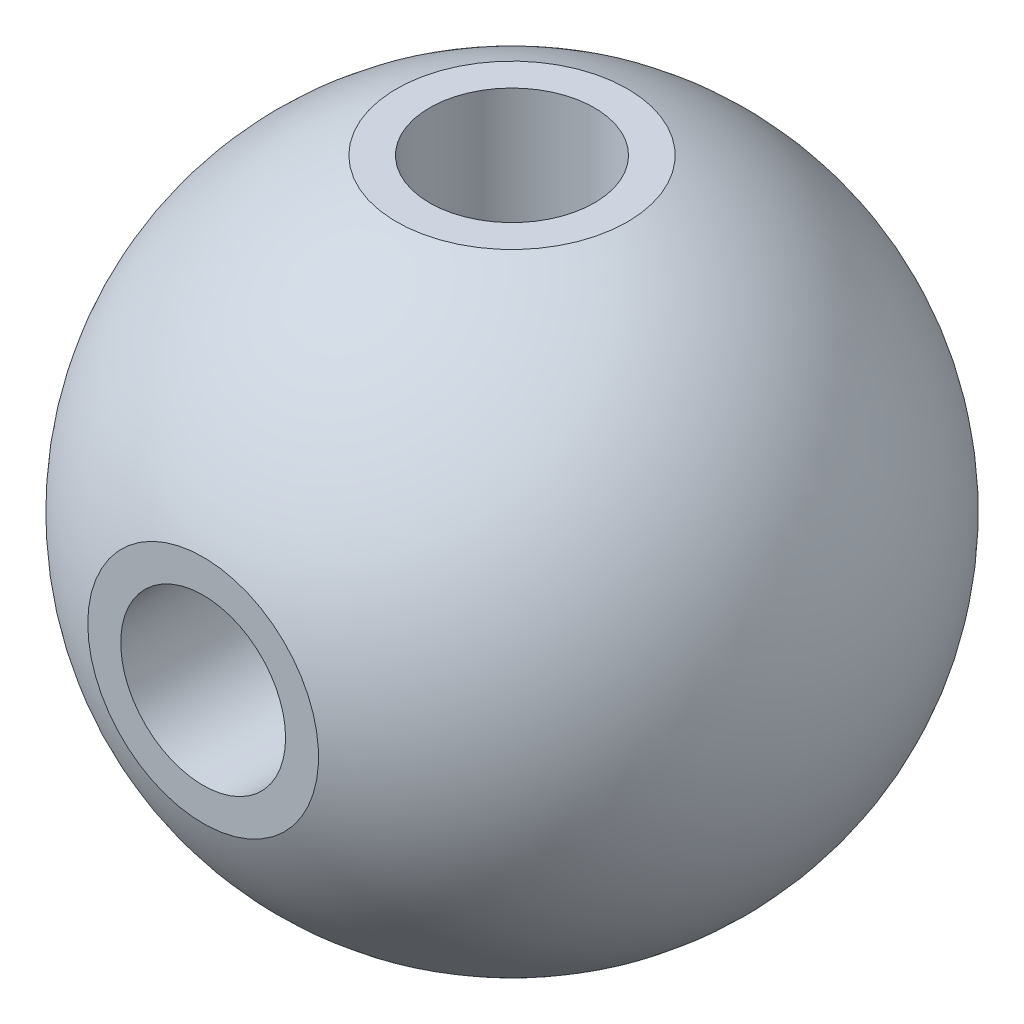
ISO-10303-21;
HEADER;
FILE_DESCRIPTION(('STEP AP214'),'2;1');
FILE_NAME('part.step','',(''),(''),'','','');
FILE_SCHEMA(('AUTOMOTIVE_DESIGN { 1 0 10303 214 1 1 1 1 }'));
ENDSEC;
DATA;
#1=APPLICATION_CONTEXT('core data for automotive mechanical design processes');
#2=APPLICATION_PROTOCOL_DEFINITION('international standard','automotive_design',2000,#1);
#3=PRODUCT_CONTEXT('',#1,'mechanical');
#4=PRODUCT('Part','Part','',(#3));
#5=PRODUCT_RELATED_PRODUCT_CATEGORY('part','',(#4));
#6=PRODUCT_DEFINITION_FORMATION('','',#4);
#7=PRODUCT_DEFINITION_CONTEXT('part definition',#1,'design');
#8=PRODUCT_DEFINITION('design','',#6,#7);
#9=PRODUCT_DEFINITION_SHAPE('','',#8);
#10=(LENGTH_UNIT() NAMED_UNIT(*) SI_UNIT(.MILLI.,.METRE.));
#11=(NAMED_UNIT(*) PLANE_ANGLE_UNIT() SI_UNIT($,.RADIAN.));
#12=(NAMED_UNIT(*) SI_UNIT($,.STERADIAN.) SOLID_ANGLE_UNIT());
#13=UNCERTAINTY_MEASURE_WITH_UNIT(LENGTH_MEASURE(1.E-05),#10,'distance_accuracy_value','');
#14=(GEOMETRIC_REPRESENTATION_CONTEXT(3) GLOBAL_UNCERTAINTY_ASSIGNED_CONTEXT((#13)) GLOBAL_UNIT_ASSIGNED_CONTEXT((#10,
#11,#12)) REPRESENTATION_CONTEXT('',''));
#15=CARTESIAN_POINT('',(0.,0.,0.));
#16=DIRECTION('',(0.,0.,1.));
#17=DIRECTION('',(1.,0.,0.));
#18=AXIS2_PLACEMENT_3D('',#15,#16,#17);
#19=CARTESIAN_POINT('',(0.,0.,0.));
#20=DIRECTION('',(0.,-1.,0.));
#21=DIRECTION('',(1.,0.,0.));
#22=AXIS2_PLACEMENT_3D('',#19,#20,#21);
#23=SPHERICAL_SURFACE('',#22,12.7);
#24=CARTESIAN_POINT('',(0.,11.8967211869489,0.));
#25=DIRECTION('',(0.,-1.,0.));
#26=DIRECTION('',(0.,0.,-1.));
#27=AXIS2_PLACEMENT_3D('',#24,#25,#26);
#28=CIRCLE('',#27,4.445);
#29=CARTESIAN_POINT('',(0.,11.8967211869489,-4.445));
#30=VERTEX_POINT('',#29);
#31=EDGE_CURVE('E70',#30,#30,#28,.T.);
#32=ORIENTED_EDGE('',*,*,#31,.T.);
#33=EDGE_LOOP('',(#32));
#34=FACE_BOUND('',#33,.T.);
#35=CARTESIAN_POINT('',(0.,0.,-11.8967211869489));
#36=DIRECTION('',(0.,0.,1.));
#37=DIRECTION('',(1.,0.,0.));
#38=AXIS2_PLACEMENT_3D('',#35,#36,#37);
#39=CIRCLE('',#38,4.445);
#40=CARTESIAN_POINT('',(4.445,0.,-11.8967211869489));
#41=VERTEX_POINT('',#40);
#42=EDGE_CURVE('E60',#41,#41,#39,.T.);
#43=ORIENTED_EDGE('',*,*,#42,.T.);
#44=EDGE_LOOP('',(#43));
#45=FACE_BOUND('',#44,.T.);
#46=CARTESIAN_POINT('',(0.,0.,11.8967211869489));
#47=DIRECTION('',(0.,0.,-1.));
#48=DIRECTION('',(-1.,0.,0.));
#49=AXIS2_PLACEMENT_3D('',#46,#47,#48);
#50=CIRCLE('',#49,4.445);
#51=CARTESIAN_POINT('',(-4.445,0.,11.8967211869489));
#52=VERTEX_POINT('',#51);
#53=EDGE_CURVE('E10',#52,#52,#50,.T.);
#54=ORIENTED_EDGE('',*,*,#53,.T.);
#55=EDGE_LOOP('',(#54));
#56=FACE_BOUND('',#55,.T.);
#57=ADVANCED_FACE('F42',(#34,#45,#56),#23,.T.);
#58=CARTESIAN_POINT('',(0.,0.,11.8967211869489));
#59=DIRECTION('',(0.,0.,-1.));
#60=DIRECTION('',(-1.,0.,0.));
#61=AXIS2_PLACEMENT_3D('',#58,#59,#60);
#62=PLANE('',#61);
#63=CARTESIAN_POINT('',(0.,0.,11.8967211869489));
#64=DIRECTION('',(0.,0.,1.));
#65=DIRECTION('',(1.,0.,0.));
#66=AXIS2_PLACEMENT_3D('',#63,#64,#65);
#67=CIRCLE('',#66,3.175);
#68=CARTESIAN_POINT('',(3.175,0.,11.8967211869489));
#69=VERTEX_POINT('',#68);
#70=EDGE_CURVE('E54',#69,#69,#67,.T.);
#71=ORIENTED_EDGE('',*,*,#70,.F.);
#72=EDGE_LOOP('',(#71));
#73=FACE_BOUND('',#72,.T.);
#74=ORIENTED_EDGE('',*,*,#53,.F.);
#75=EDGE_LOOP('',(#74));
#76=FACE_BOUND('',#75,.T.);
#77=ADVANCED_FACE('F103',(#73,#76),#62,.F.);
#78=CARTESIAN_POINT('',(0.,0.,4.27672118694895));
#79=DIRECTION('',(0.,0.,1.));
#80=DIRECTION('',(1.,0.,0.));
#81=AXIS2_PLACEMENT_3D('',#78,#79,#80);
#82=CYLINDRICAL_SURFACE('',#81,3.175);
#83=CARTESIAN_POINT('',(0.,0.,4.27672118694895));
#84=DIRECTION('',(0.,0.,1.));
#85=DIRECTION('',(1.,0.,0.));
#86=AXIS2_PLACEMENT_3D('',#83,#84,#85);
#87=CIRCLE('',#86,3.175);
#88=CARTESIAN_POINT('',(3.175,0.,4.27672118694895));
#89=VERTEX_POINT('',#88);
#90=EDGE_CURVE('E49',#89,#89,#87,.T.);
#91=CARTESIAN_POINT('',(3.175,0.,4.27672118694895));
#92=CARTESIAN_POINT('',(3.175,0.,4.35609618694895));
#93=CARTESIAN_POINT('',(3.175,0.,4.43547118694895));
#94=CARTESIAN_POINT('',(3.175,0.,4.59422118694895));
#95=CARTESIAN_POINT('',(3.175,0.,4.67359618694895));
#96=CARTESIAN_POINT('',(3.175,0.,4.83234618694895));
#97=CARTESIAN_POINT('',(3.175,0.,4.91172118694895));
#98=CARTESIAN_POINT('',(3.175,0.,5.07047118694895));
#99=CARTESIAN_POINT('',(3.175,0.,5.14984618694895));
#100=CARTESIAN_POINT('',(3.175,0.,5.30859618694895));
#101=CARTESIAN_POINT('',(3.175,0.,5.38797118694895));
#102=CARTESIAN_POINT('',(3.175,0.,5.54672118694895));
#103=CARTESIAN_POINT('',(3.175,0.,5.62609618694895));
#104=CARTESIAN_POINT('',(3.175,0.,5.78484618694895));
#105=CARTESIAN_POINT('',(3.175,0.,5.86422118694895));
#106=CARTESIAN_POINT('',(3.175,0.,6.02297118694895));
#107=CARTESIAN_POINT('',(3.175,0.,6.10234618694895));
#108=CARTESIAN_POINT('',(3.175,0.,6.26109618694895));
#109=CARTESIAN_POINT('',(3.175,0.,6.34047118694895));
#110=CARTESIAN_POINT('',(3.175,0.,6.49922118694895));
#111=CARTESIAN_POINT('',(3.175,0.,6.57859618694895));
#112=CARTESIAN_POINT('',(3.175,0.,6.73734618694895));
#113=CARTESIAN_POINT('',(3.175,0.,6.81672118694895));
#114=CARTESIAN_POINT('',(3.175,0.,6.97547118694895));
#115=CARTESIAN_POINT('',(3.175,0.,7.05484618694895));
#116=CARTESIAN_POINT('',(3.175,0.,7.21359618694895));
#117=CARTESIAN_POINT('',(3.175,0.,7.29297118694895));
#118=CARTESIAN_POINT('',(3.175,0.,7.45172118694895));
#119=CARTESIAN_POINT('',(3.175,0.,7.53109618694895));
#120=CARTESIAN_POINT('',(3.175,0.,7.68984618694895));
#121=CARTESIAN_POINT('',(3.175,0.,7.76922118694895));
#122=CARTESIAN_POINT('',(3.175,0.,7.92797118694895));
#123=CARTESIAN_POINT('',(3.175,0.,8.00734618694895));
#124=CARTESIAN_POINT('',(3.175,0.,8.16609618694895));
#125=CARTESIAN_POINT('',(3.175,0.,8.24547118694895));
#126=CARTESIAN_POINT('',(3.175,0.,8.40422118694895));
#127=CARTESIAN_POINT('',(3.175,0.,8.48359618694895));
#128=CARTESIAN_POINT('',(3.175,0.,8.64234618694895));
#129=CARTESIAN_POINT('',(3.175,0.,8.72172118694895));
#130=CARTESIAN_POINT('',(3.175,0.,8.88047118694895));
#131=CARTESIAN_POINT('',(3.175,0.,8.95984618694895));
#132=CARTESIAN_POINT('',(3.175,0.,9.11859618694895));
#133=CARTESIAN_POINT('',(3.175,0.,9.19797118694895));
#134=CARTESIAN_POINT('',(3.175,0.,9.35672118694895));
#135=CARTESIAN_POINT('',(3.175,0.,9.43609618694895));
#136=CARTESIAN_POINT('',(3.175,0.,9.59484618694895));
#137=CARTESIAN_POINT('',(3.175,0.,9.67422118694895));
#138=CARTESIAN_POINT('',(3.175,0.,9.83297118694895));
#139=CARTESIAN_POINT('',(3.175,0.,9.91234618694895));
#140=CARTESIAN_POINT('',(3.175,0.,10.0710961869489));
#141=CARTESIAN_POINT('',(3.175,0.,10.1504711869489));
#142=CARTESIAN_POINT('',(3.175,0.,10.3092211869489));
#143=CARTESIAN_POINT('',(3.175,0.,10.3885961869489));
#144=CARTESIAN_POINT('',(3.175,0.,10.5473461869489));
#145=CARTESIAN_POINT('',(3.175,0.,10.6267211869489));
#146=CARTESIAN_POINT('',(3.175,0.,10.7854711869489));
#147=CARTESIAN_POINT('',(3.175,0.,10.8648461869489));
#148=CARTESIAN_POINT('',(3.175,0.,11.0235961869489));
#149=CARTESIAN_POINT('',(3.175,0.,11.1029711869489));
#150=CARTESIAN_POINT('',(3.175,0.,11.2617211869489));
#151=CARTESIAN_POINT('',(3.175,0.,11.3410961869489));
#152=CARTESIAN_POINT('',(3.175,0.,11.4998461869489));
#153=CARTESIAN_POINT('',(3.175,0.,11.5792211869489));
#154=CARTESIAN_POINT('',(3.175,0.,11.7379711869489));
#155=CARTESIAN_POINT('',(3.175,0.,11.8173461869489));
#156=CARTESIAN_POINT('',(3.175,0.,11.8967211869489));
#157=B_SPLINE_CURVE_WITH_KNOTS('',3,(#91,#92,#93,#94,#95,#96,#97,#98,#99,#100,#101,#102,#103,
#104,#105,#106,#107,#108,#109,#110,#111,#112,#113,#114,#115,#116,#117,#118,#119,#120,#121,#122,
#123,#124,#125,#126,#127,#128,#129,#130,#131,#132,#133,#134,#135,#136,#137,#138,#139,#140,#141,
#142,#143,#144,#145,#146,#147,#148,#149,#150,#151,#152,#153,#154,#155,#156),.UNSPECIFIED.,.F.,
.F.,(4,2,2,2,2,2,2,2,2,2,2,2,2,2,2,2,2,2,2,2,2,2,2,2,2,2,2,2,2,2,2,2,4),(0.,0.238125,
0.476249999999999,0.714374999999999,0.952499999999999,1.190625,1.42875,1.666875,1.905,2.143125,
2.38125,2.619375,2.8575,3.095625,3.33375,3.571875,3.81,4.048125,4.28625,4.524375,4.7625,
5.000625,5.23875,5.476875,5.715,5.953125,6.19125,6.429375,6.6675,6.905625,7.14375,7.381875,
7.62),.UNSPECIFIED.);
#158=EDGE_CURVE('BSEAM118',#89,#69,#157,.T.);
#159=ORIENTED_EDGE('',*,*,#90,.F.);
#160=ORIENTED_EDGE('',*,*,#70,.T.);
#161=ORIENTED_EDGE('',*,*,#158,.T.);
#162=ORIENTED_EDGE('',*,*,#158,.F.);
#163=EDGE_LOOP('',(#159,#161,#160,#162));
#164=FACE_BOUND('',#163,.T.);
#165=ADVANCED_FACE('F118',(#164),#82,.F.);
#166=CARTESIAN_POINT('',(0.,0.,4.27672118694895));
#167=DIRECTION('',(0.,0.,1.));
#168=DIRECTION('',(1.,0.,0.));
#169=AXIS2_PLACEMENT_3D('',#166,#167,#168);
#170=PLANE('',#169);
#171=ORIENTED_EDGE('',*,*,#90,.T.);
#172=EDGE_LOOP('',(#171));
#173=FACE_BOUND('',#172,.T.);
#174=ADVANCED_FACE('F109',(#173),#170,.T.);
#175=CARTESIAN_POINT('',(0.,0.,-11.8967211869489));
#176=DIRECTION('',(0.,0.,1.));
#177=DIRECTION('',(1.,0.,0.));
#178=AXIS2_PLACEMENT_3D('',#175,#176,#177);
#179=PLANE('',#178);
#180=CARTESIAN_POINT('',(0.,0.,-11.8967211869489));
#181=DIRECTION('',(0.,0.,1.));
#182=DIRECTION('',(1.,0.,0.));
#183=AXIS2_PLACEMENT_3D('',#180,#181,#182);
#184=CIRCLE('',#183,3.175);
#185=CARTESIAN_POINT('',(-3.175,0.,-11.8967211869489));
#186=VERTEX_POINT('',#185);
#187=EDGE_CURVE('E66',#186,#186,#184,.T.);
#188=ORIENTED_EDGE('',*,*,#187,.T.);
#189=EDGE_LOOP('',(#188));
#190=FACE_BOUND('',#189,.T.);
#191=ORIENTED_EDGE('',*,*,#42,.F.);
#192=EDGE_LOOP('',(#191));
#193=FACE_BOUND('',#192,.T.);
#194=ADVANCED_FACE('F106',(#190,#193),#179,.F.);
#195=CARTESIAN_POINT('',(0.,0.,-4.27672118694895));
#196=DIRECTION('',(0.,0.,-1.));
#197=DIRECTION('',(-1.,0.,0.));
#198=AXIS2_PLACEMENT_3D('',#195,#196,#197);
#199=CYLINDRICAL_SURFACE('',#198,3.175);
#200=CARTESIAN_POINT('',(0.,0.,-4.27672118694895));
#201=DIRECTION('',(0.,0.,1.));
#202=DIRECTION('',(1.,0.,0.));
#203=AXIS2_PLACEMENT_3D('',#200,#201,#202);
#204=CIRCLE('',#203,3.175);
#205=CARTESIAN_POINT('',(-3.175,0.,-4.27672118694895));
#206=VERTEX_POINT('',#205);
#207=EDGE_CURVE('E65',#206,#206,#204,.T.);
#208=CARTESIAN_POINT('',(-3.175,0.,-4.27672118694895));
#209=CARTESIAN_POINT('',(-3.175,0.,-4.35609618694895));
#210=CARTESIAN_POINT('',(-3.175,0.,-4.43547118694895));
#211=CARTESIAN_POINT('',(-3.175,0.,-4.59422118694895));
#212=CARTESIAN_POINT('',(-3.175,0.,-4.67359618694895));
#213=CARTESIAN_POINT('',(-3.175,0.,-4.83234618694895));
#214=CARTESIAN_POINT('',(-3.175,0.,-4.91172118694895));
#215=CARTESIAN_POINT('',(-3.175,0.,-5.07047118694895));
#216=CARTESIAN_POINT('',(-3.175,0.,-5.14984618694895));
#217=CARTESIAN_POINT('',(-3.175,0.,-5.30859618694895));
#218=CARTESIAN_POINT('',(-3.175,0.,-5.38797118694895));
#219=CARTESIAN_POINT('',(-3.175,0.,-5.54672118694895));
#220=CARTESIAN_POINT('',(-3.175,0.,-5.62609618694895));
#221=CARTESIAN_POINT('',(-3.175,0.,-5.78484618694895));
#222=CARTESIAN_POINT('',(-3.175,0.,-5.86422118694895));
#223=CARTESIAN_POINT('',(-3.175,0.,-6.02297118694895));
#224=CARTESIAN_POINT('',(-3.175,0.,-6.10234618694895));
#225=CARTESIAN_POINT('',(-3.175,0.,-6.26109618694895));
#226=CARTESIAN_POINT('',(-3.175,0.,-6.34047118694895));
#227=CARTESIAN_POINT('',(-3.175,0.,-6.49922118694895));
#228=CARTESIAN_POINT('',(-3.175,0.,-6.57859618694895));
#229=CARTESIAN_POINT('',(-3.175,0.,-6.73734618694895));
#230=CARTESIAN_POINT('',(-3.175,0.,-6.81672118694895));
#231=CARTESIAN_POINT('',(-3.175,0.,-6.97547118694895));
#232=CARTESIAN_POINT('',(-3.175,0.,-7.05484618694895));
#233=CARTESIAN_POINT('',(-3.175,0.,-7.21359618694895));
#234=CARTESIAN_POINT('',(-3.175,0.,-7.29297118694895));
#235=CARTESIAN_POINT('',(-3.175,0.,-7.45172118694895));
#236=CARTESIAN_POINT('',(-3.175,0.,-7.53109618694895));
#237=CARTESIAN_POINT('',(-3.175,0.,-7.68984618694895));
#238=CARTESIAN_POINT('',(-3.175,0.,-7.76922118694895));
#239=CARTESIAN_POINT('',(-3.175,0.,-7.92797118694895));
#240=CARTESIAN_POINT('',(-3.175,0.,-8.00734618694895));
#241=CARTESIAN_POINT('',(-3.175,0.,-8.16609618694895));
#242=CARTESIAN_POINT('',(-3.175,0.,-8.24547118694895));
#243=CARTESIAN_POINT('',(-3.175,0.,-8.40422118694895));
#244=CARTESIAN_POINT('',(-3.175,0.,-8.48359618694895));
#245=CARTESIAN_POINT('',(-3.175,0.,-8.64234618694895));
#246=CARTESIAN_POINT('',(-3.175,0.,-8.72172118694895));
#247=CARTESIAN_POINT('',(-3.175,0.,-8.88047118694895));
#248=CARTESIAN_POINT('',(-3.175,0.,-8.95984618694895));
#249=CARTESIAN_POINT('',(-3.175,0.,-9.11859618694895));
#250=CARTESIAN_POINT('',(-3.175,0.,-9.19797118694895));
#251=CARTESIAN_POINT('',(-3.175,0.,-9.35672118694895));
#252=CARTESIAN_POINT('',(-3.175,0.,-9.43609618694895));
#253=CARTESIAN_POINT('',(-3.175,0.,-9.59484618694895));
#254=CARTESIAN_POINT('',(-3.175,0.,-9.67422118694895));
#255=CARTESIAN_POINT('',(-3.175,0.,-9.83297118694895));
#256=CARTESIAN_POINT('',(-3.175,0.,-9.91234618694895));
#257=CARTESIAN_POINT('',(-3.175,0.,-10.0710961869489));
#258=CARTESIAN_POINT('',(-3.175,0.,-10.150471186949));
#259=CARTESIAN_POINT('',(-3.175,0.,-10.3092211869489));
#260=CARTESIAN_POINT('',(-3.175,0.,-10.3885961869489));
#261=CARTESIAN_POINT('',(-3.175,0.,-10.5473461869489));
#262=CARTESIAN_POINT('',(-3.175,0.,-10.626721186949));
#263=CARTESIAN_POINT('',(-3.175,0.,-10.7854711869489));
#264=CARTESIAN_POINT('',(-3.175,0.,-10.864846186949));
#265=CARTESIAN_POINT('',(-3.175,0.,-11.023596186949));
#266=CARTESIAN_POINT('',(-3.175,0.,-11.102971186949));
#267=CARTESIAN_POINT('',(-3.175,0.,-11.261721186949));
#268=CARTESIAN_POINT('',(-3.175,0.,-11.341096186949));
#269=CARTESIAN_POINT('',(-3.175,0.,-11.499846186949));
#270=CARTESIAN_POINT('',(-3.175,0.,-11.5792211869489));
#271=CARTESIAN_POINT('',(-3.175,0.,-11.7379711869489));
#272=CARTESIAN_POINT('',(-3.175,0.,-11.817346186949));
#273=CARTESIAN_POINT('',(-3.175,0.,-11.8967211869489));
#274=B_SPLINE_CURVE_WITH_KNOTS('',3,(#208,#209,#210,#211,#212,#213,#214,#215,#216,#217,#218,
#219,#220,#221,#222,#223,#224,#225,#226,#227,#228,#229,#230,#231,#232,#233,#234,#235,#236,#237,
#238,#239,#240,#241,#242,#243,#244,#245,#246,#247,#248,#249,#250,#251,#252,#253,#254,#255,#256,
#257,#258,#259,#260,#261,#262,#263,#264,#265,#266,#267,#268,#269,#270,#271,#272,#273),
.UNSPECIFIED.,.F.,.F.,(4,2,2,2,2,2,2,2,2,2,2,2,2,2,2,2,2,2,2,2,2,2,2,2,2,2,2,2,2,2,2,2,4),(0.,
0.238125,0.47625,0.714375000000001,0.9525,1.190625,1.42875,1.666875,1.905,2.143125,2.38125,
2.619375,2.8575,3.095625,3.33375,3.571875,3.81,4.048125,4.28625,4.524375,4.7625,5.000625,
5.23875,5.476875,5.715,5.953125,6.19125,6.429375,6.6675,6.905625,7.14375,7.381875,7.62),.UNSPECIFIED.);
#275=EDGE_CURVE('BSEAM108',#206,#186,#274,.T.);
#276=ORIENTED_EDGE('',*,*,#207,.T.);
#277=ORIENTED_EDGE('',*,*,#187,.F.);
#278=ORIENTED_EDGE('',*,*,#275,.T.);
#279=ORIENTED_EDGE('',*,*,#275,.F.);
#280=EDGE_LOOP('',(#276,#278,#277,#279));
#281=FACE_BOUND('',#280,.T.);
#282=ADVANCED_FACE('F108',(#281),#199,.F.);
#283=CARTESIAN_POINT('',(0.,0.,-4.27672118694895));
#284=DIRECTION('',(0.,0.,-1.));
#285=DIRECTION('',(1.,0.,0.));
#286=AXIS2_PLACEMENT_3D('',#283,#284,#285);
#287=PLANE('',#286);
#288=ORIENTED_EDGE('',*,*,#207,.F.);
#289=EDGE_LOOP('',(#288));
#290=FACE_BOUND('',#289,.T.);
#291=ADVANCED_FACE('F97',(#290),#287,.T.);
#292=CARTESIAN_POINT('',(0.,11.8967211869489,0.));
#293=DIRECTION('',(0.,-1.,0.));
#294=DIRECTION('',(0.,0.,-1.));
#295=AXIS2_PLACEMENT_3D('',#292,#293,#294);
#296=PLANE('',#295);
#297=CARTESIAN_POINT('',(0.,11.8967211869489,0.));
#298=DIRECTION('',(0.,1.,0.));
#299=DIRECTION('',(0.,0.,1.));
#300=AXIS2_PLACEMENT_3D('',#297,#298,#299);
#301=CIRCLE('',#300,3.175);
#302=CARTESIAN_POINT('',(0.,11.8967211869489,3.175));
#303=VERTEX_POINT('',#302);
#304=EDGE_CURVE('E78',#303,#303,#301,.T.);
#305=ORIENTED_EDGE('',*,*,#304,.F.);
#306=EDGE_LOOP('',(#305));
#307=FACE_BOUND('',#306,.T.);
#308=ORIENTED_EDGE('',*,*,#31,.F.);
#309=EDGE_LOOP('',(#308));
#310=FACE_BOUND('',#309,.T.);
#311=ADVANCED_FACE('F91',(#307,#310),#296,.F.);
#312=CARTESIAN_POINT('',(0.,4.27672118694895,0.));
#313=DIRECTION('',(0.,1.,0.));
#314=DIRECTION('',(0.,0.,1.));
#315=AXIS2_PLACEMENT_3D('',#312,#313,#314);
#316=CYLINDRICAL_SURFACE('',#315,3.175);
#317=CARTESIAN_POINT('',(0.,4.27672118694895,0.));
#318=DIRECTION('',(0.,1.,0.));
#319=DIRECTION('',(0.,0.,1.));
#320=AXIS2_PLACEMENT_3D('',#317,#318,#319);
#321=CIRCLE('',#320,3.175);
#322=CARTESIAN_POINT('',(0.,4.27672118694895,3.175));
#323=VERTEX_POINT('',#322);
#324=EDGE_CURVE('E77',#323,#323,#321,.T.);
#325=CARTESIAN_POINT('',(0.,4.27672118694895,3.175));
#326=CARTESIAN_POINT('',(0.,4.35609618694895,3.175));
#327=CARTESIAN_POINT('',(0.,4.43547118694895,3.175));
#328=CARTESIAN_POINT('',(0.,4.59422118694895,3.175));
#329=CARTESIAN_POINT('',(0.,4.67359618694895,3.175));
#330=CARTESIAN_POINT('',(0.,4.83234618694895,3.175));
#331=CARTESIAN_POINT('',(0.,4.91172118694895,3.175));
#332=CARTESIAN_POINT('',(0.,5.07047118694895,3.175));
#333=CARTESIAN_POINT('',(0.,5.14984618694895,3.175));
#334=CARTESIAN_POINT('',(0.,5.30859618694895,3.175));
#335=CARTESIAN_POINT('',(0.,5.38797118694895,3.175));
#336=CARTESIAN_POINT('',(0.,5.54672118694895,3.175));
#337=CARTESIAN_POINT('',(0.,5.62609618694895,3.175));
#338=CARTESIAN_POINT('',(0.,5.78484618694895,3.175));
#339=CARTESIAN_POINT('',(0.,5.86422118694895,3.175));
#340=CARTESIAN_POINT('',(0.,6.02297118694895,3.175));
#341=CARTESIAN_POINT('',(0.,6.10234618694895,3.175));
#342=CARTESIAN_POINT('',(0.,6.26109618694895,3.175));
#343=CARTESIAN_POINT('',(0.,6.34047118694895,3.175));
#344=CARTESIAN_POINT('',(0.,6.49922118694895,3.175));
#345=CARTESIAN_POINT('',(0.,6.57859618694895,3.175));
#346=CARTESIAN_POINT('',(0.,6.73734618694895,3.175));
#347=CARTESIAN_POINT('',(0.,6.81672118694895,3.175));
#348=CARTESIAN_POINT('',(0.,6.97547118694895,3.175));
#349=CARTESIAN_POINT('',(0.,7.05484618694895,3.175));
#350=CARTESIAN_POINT('',(0.,7.21359618694895,3.175));
#351=CARTESIAN_POINT('',(0.,7.29297118694895,3.175));
#352=CARTESIAN_POINT('',(0.,7.45172118694895,3.175));
#353=CARTESIAN_POINT('',(0.,7.53109618694895,3.175));
#354=CARTESIAN_POINT('',(0.,7.68984618694895,3.175));
#355=CARTESIAN_POINT('',(0.,7.76922118694895,3.175));
#356=CARTESIAN_POINT('',(0.,7.92797118694895,3.175));
#357=CARTESIAN_POINT('',(0.,8.00734618694895,3.175));
#358=CARTESIAN_POINT('',(0.,8.16609618694895,3.175));
#359=CARTESIAN_POINT('',(0.,8.24547118694895,3.175));
#360=CARTESIAN_POINT('',(0.,8.40422118694895,3.175));
#361=CARTESIAN_POINT('',(0.,8.48359618694895,3.175));
#362=CARTESIAN_POINT('',(0.,8.64234618694895,3.175));
#363=CARTESIAN_POINT('',(0.,8.72172118694895,3.175));
#364=CARTESIAN_POINT('',(0.,8.88047118694895,3.175));
#365=CARTESIAN_POINT('',(0.,8.95984618694895,3.175));
#366=CARTESIAN_POINT('',(0.,9.11859618694895,3.175));
#367=CARTESIAN_POINT('',(0.,9.19797118694895,3.175));
#368=CARTESIAN_POINT('',(0.,9.35672118694895,3.175));
#369=CARTESIAN_POINT('',(0.,9.43609618694895,3.175));
#370=CARTESIAN_POINT('',(0.,9.59484618694895,3.175));
#371=CARTESIAN_POINT('',(0.,9.67422118694895,3.175));
#372=CARTESIAN_POINT('',(0.,9.83297118694895,3.175));
#373=CARTESIAN_POINT('',(0.,9.91234618694895,3.175));
#374=CARTESIAN_POINT('',(0.,10.0710961869489,3.175));
#375=CARTESIAN_POINT('',(0.,10.1504711869489,3.175));
#376=CARTESIAN_POINT('',(0.,10.3092211869489,3.175));
#377=CARTESIAN_POINT('',(0.,10.3885961869489,3.175));
#378=CARTESIAN_POINT('',(0.,10.5473461869489,3.175));
#379=CARTESIAN_POINT('',(0.,10.6267211869489,3.175));
#380=CARTESIAN_POINT('',(0.,10.7854711869489,3.175));
#381=CARTESIAN_POINT('',(0.,10.8648461869489,3.175));
#382=CARTESIAN_POINT('',(0.,11.0235961869489,3.175));
#383=CARTESIAN_POINT('',(0.,11.1029711869489,3.175));
#384=CARTESIAN_POINT('',(0.,11.2617211869489,3.175));
#385=CARTESIAN_POINT('',(0.,11.3410961869489,3.175));
#386=CARTESIAN_POINT('',(0.,11.4998461869489,3.175));
#387=CARTESIAN_POINT('',(0.,11.5792211869489,3.175));
#388=CARTESIAN_POINT('',(0.,11.7379711869489,3.175));
#389=CARTESIAN_POINT('',(0.,11.8173461869489,3.175));
#390=CARTESIAN_POINT('',(0.,11.8967211869489,3.175));
#391=B_SPLINE_CURVE_WITH_KNOTS('',3,(#325,#326,#327,#328,#329,#330,#331,#332,#333,#334,#335,
#336,#337,#338,#339,#340,#341,#342,#343,#344,#345,#346,#347,#348,#349,#350,#351,#352,#353,#354,
#355,#356,#357,#358,#359,#360,#361,#362,#363,#364,#365,#366,#367,#368,#369,#370,#371,#372,#373,
#374,#375,#376,#377,#378,#379,#380,#381,#382,#383,#384,#385,#386,#387,#388,#389,#390),
.UNSPECIFIED.,.F.,.F.,(4,2,2,2,2,2,2,2,2,2,2,2,2,2,2,2,2,2,2,2,2,2,2,2,2,2,2,2,2,2,2,2,4),(0.,
0.238125,0.476249999999999,0.714374999999999,0.952499999999999,1.190625,1.42875,1.666875,1.905,
2.143125,2.38125,2.619375,2.8575,3.095625,3.33375,3.571875,3.81,4.048125,4.28625,4.524375,
4.7625,5.000625,5.23875,5.476875,5.715,5.953125,6.19125,6.429375,6.6675,6.905625,7.14375,
7.381875,7.62),.UNSPECIFIED.);
#392=EDGE_CURVE('BSEAM88',#323,#303,#391,.T.);
#393=ORIENTED_EDGE('',*,*,#324,.F.);
#394=ORIENTED_EDGE('',*,*,#304,.T.);
#395=ORIENTED_EDGE('',*,*,#392,.T.);
#396=ORIENTED_EDGE('',*,*,#392,.F.);
#397=EDGE_LOOP('',(#393,#395,#394,#396));
#398=FACE_BOUND('',#397,.T.);
#399=ADVANCED_FACE('F88',(#398),#316,.F.);
#400=CARTESIAN_POINT('',(0.,4.27672118694895,0.));
#401=DIRECTION('',(0.,1.,0.));
#402=DIRECTION('',(0.,0.,1.));
#403=AXIS2_PLACEMENT_3D('',#400,#401,#402);
#404=PLANE('',#403);
#405=ORIENTED_EDGE('',*,*,#324,.T.);
#406=EDGE_LOOP('',(#405));
#407=FACE_BOUND('',#406,.T.);
#408=ADVANCED_FACE('F86',(#407),#404,.T.);
#409=CLOSED_SHELL('',(#57,#77,#165,#174,#194,#282,#291,#311,#399,#408));
#410=MANIFOLD_SOLID_BREP('B2',#409);
#411=ADVANCED_BREP_SHAPE_REPRESENTATION('',(#18,#410),#14);
#412=SHAPE_DEFINITION_REPRESENTATION(#9,#411);
ENDSEC;
END-ISO-10303-21;
